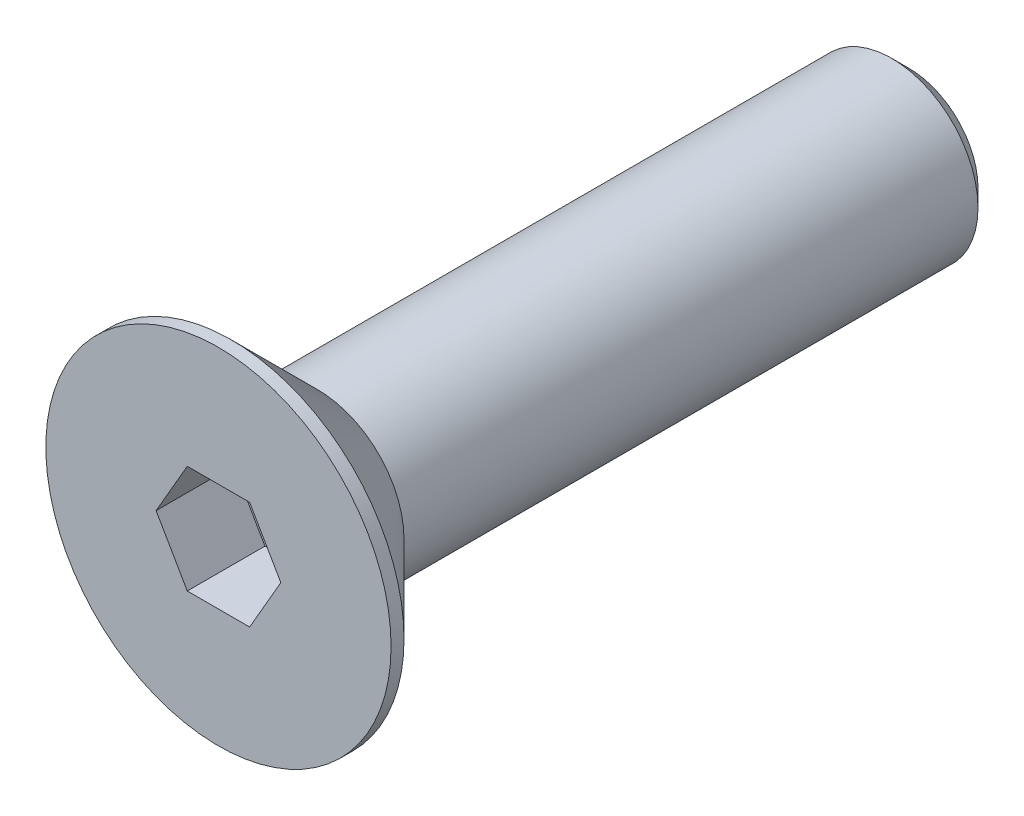
ISO-10303-21;
HEADER;
FILE_DESCRIPTION(('STEP AP214'),'2;1');
FILE_NAME('part.step','',(''),(''),'','','');
FILE_SCHEMA(('AUTOMOTIVE_DESIGN { 1 0 10303 214 1 1 1 1 }'));
ENDSEC;
DATA;
#1=APPLICATION_CONTEXT('core data for automotive mechanical design processes');
#2=APPLICATION_PROTOCOL_DEFINITION('international standard','automotive_design',2000,#1);
#3=PRODUCT_CONTEXT('',#1,'mechanical');
#4=PRODUCT('Part','Part','',(#3));
#5=PRODUCT_RELATED_PRODUCT_CATEGORY('part','',(#4));
#6=PRODUCT_DEFINITION_FORMATION('','',#4);
#7=PRODUCT_DEFINITION_CONTEXT('part definition',#1,'design');
#8=PRODUCT_DEFINITION('design','',#6,#7);
#9=PRODUCT_DEFINITION_SHAPE('','',#8);
#10=(LENGTH_UNIT() NAMED_UNIT(*) SI_UNIT(.MILLI.,.METRE.));
#11=(NAMED_UNIT(*) PLANE_ANGLE_UNIT() SI_UNIT($,.RADIAN.));
#12=(NAMED_UNIT(*) SI_UNIT($,.STERADIAN.) SOLID_ANGLE_UNIT());
#13=UNCERTAINTY_MEASURE_WITH_UNIT(LENGTH_MEASURE(1.E-05),#10,'distance_accuracy_value','');
#14=(GEOMETRIC_REPRESENTATION_CONTEXT(3) GLOBAL_UNCERTAINTY_ASSIGNED_CONTEXT((#13)) GLOBAL_UNIT_ASSIGNED_CONTEXT((#10,
#11,#12)) REPRESENTATION_CONTEXT('',''));
#15=CARTESIAN_POINT('',(0.,0.,0.));
#16=DIRECTION('',(0.,0.,1.));
#17=DIRECTION('',(1.,0.,0.));
#18=AXIS2_PLACEMENT_3D('',#15,#16,#17);
#19=CARTESIAN_POINT('',(0.,0.,-13.7));
#20=DIRECTION('',(0.,0.,1.));
#21=DIRECTION('',(1.,0.,0.));
#22=AXIS2_PLACEMENT_3D('',#19,#20,#21);
#23=PLANE('',#22);
#24=CARTESIAN_POINT('',(0.,0.,-13.7));
#25=DIRECTION('',(0.,0.,1.));
#26=DIRECTION('',(1.,0.,0.));
#27=AXIS2_PLACEMENT_3D('',#24,#25,#26);
#28=CIRCLE('',#27,1.6);
#29=CARTESIAN_POINT('',(1.6,0.,-13.7));
#30=VERTEX_POINT('',#29);
#31=EDGE_CURVE('E28',#30,#30,#28,.T.);
#32=ORIENTED_EDGE('',*,*,#31,.F.);
#33=EDGE_LOOP('',(#32));
#34=FACE_BOUND('',#33,.T.);
#35=ADVANCED_FACE('F17',(#34),#23,.F.);
#36=CARTESIAN_POINT('',(0.,0.,-13.7));
#37=DIRECTION('',(0.,0.,1.));
#38=DIRECTION('',(1.,0.,0.));
#39=AXIS2_PLACEMENT_3D('',#36,#37,#38);
#40=CONICAL_SURFACE('',#39,1.6,0.785398163397);
#41=ORIENTED_EDGE('',*,*,#31,.T.);
#42=DIRECTION('',(0.707106781186548,0.,0.707106781186548));
#43=VECTOR('',#42,1.);
#44=CARTESIAN_POINT('',(1.6,0.,-13.7));
#45=LINE('',#44,#43);
#46=CARTESIAN_POINT('',(2.,0.,-13.3));
#47=VERTEX_POINT('',#46);
#48=EDGE_CURVE('E11',#30,#47,#45,.T.);
#49=ORIENTED_EDGE('',*,*,#48,.T.);
#50=CARTESIAN_POINT('',(0.,0.,-13.3));
#51=DIRECTION('',(0.,0.,1.));
#52=DIRECTION('',(1.,0.,0.));
#53=AXIS2_PLACEMENT_3D('',#50,#51,#52);
#54=CIRCLE('',#53,2.);
#55=EDGE_CURVE('E161',#47,#47,#54,.T.);
#56=ORIENTED_EDGE('',*,*,#55,.F.);
#57=ORIENTED_EDGE('',*,*,#48,.F.);
#58=EDGE_LOOP('',(#41,#49,#56,#57));
#59=FACE_BOUND('',#58,.T.);
#60=ADVANCED_FACE('F217',(#59),#40,.T.);
#61=CARTESIAN_POINT('',(0.,0.,-13.3));
#62=DIRECTION('',(0.,0.,1.));
#63=DIRECTION('',(1.,0.,0.));
#64=AXIS2_PLACEMENT_3D('',#61,#62,#63);
#65=CYLINDRICAL_SURFACE('',#64,2.);
#66=ORIENTED_EDGE('',*,*,#55,.T.);
#67=DIRECTION('',(0.,0.,1.));
#68=VECTOR('',#67,1.);
#69=CARTESIAN_POINT('',(2.,0.,-13.3));
#70=LINE('',#69,#68);
#71=CARTESIAN_POINT('',(2.,0.,0.));
#72=VERTEX_POINT('',#71);
#73=EDGE_CURVE('E164',#47,#72,#70,.T.);
#74=ORIENTED_EDGE('',*,*,#73,.T.);
#75=CARTESIAN_POINT('',(0.,0.,0.));
#76=DIRECTION('',(0.,0.,1.));
#77=DIRECTION('',(1.,0.,0.));
#78=AXIS2_PLACEMENT_3D('',#75,#76,#77);
#79=CIRCLE('',#78,2.);
#80=EDGE_CURVE('E165',#72,#72,#79,.T.);
#81=ORIENTED_EDGE('',*,*,#80,.F.);
#82=ORIENTED_EDGE('',*,*,#73,.F.);
#83=EDGE_LOOP('',(#66,#74,#81,#82));
#84=FACE_BOUND('',#83,.T.);
#85=ADVANCED_FACE('F226',(#84),#65,.T.);
#86=CARTESIAN_POINT('',(0.,0.,0.5));
#87=DIRECTION('',(0.,0.,1.));
#88=DIRECTION('',(1.,0.,0.));
#89=AXIS2_PLACEMENT_3D('',#86,#87,#88);
#90=PLANE('',#89);
#91=DIRECTION('',(-0.50000000000019,0.866025403784329,0.));
#92=VECTOR('',#91,1.);
#93=CARTESIAN_POINT('',(1.445,0.,0.5));
#94=LINE('',#93,#92);
#95=CARTESIAN_POINT('',(1.445,0.,0.5));
#96=VERTEX_POINT('',#95);
#97=CARTESIAN_POINT('',(0.7225,1.251406708469,0.5));
#98=VERTEX_POINT('',#97);
#99=EDGE_CURVE('E101',#96,#98,#94,.T.);
#100=ORIENTED_EDGE('',*,*,#99,.T.);
#101=DIRECTION('',(-1.,0.,0.));
#102=VECTOR('',#101,1.);
#103=CARTESIAN_POINT('',(0.7225,1.251406708469,0.5));
#104=LINE('',#103,#102);
#105=CARTESIAN_POINT('',(-0.7225,1.251406708469,0.5));
#106=VERTEX_POINT('',#105);
#107=EDGE_CURVE('E94',#98,#106,#104,.T.);
#108=ORIENTED_EDGE('',*,*,#107,.T.);
#109=DIRECTION('',(-0.50000000000019,-0.866025403784329,0.));
#110=VECTOR('',#109,1.);
#111=CARTESIAN_POINT('',(-0.7225,1.251406708469,0.5));
#112=LINE('',#111,#110);
#113=CARTESIAN_POINT('',(-1.445,0.,0.5));
#114=VERTEX_POINT('',#113);
#115=EDGE_CURVE('E168',#106,#114,#112,.T.);
#116=ORIENTED_EDGE('',*,*,#115,.T.);
#117=DIRECTION('',(0.50000000000019,-0.866025403784329,0.));
#118=VECTOR('',#117,1.);
#119=CARTESIAN_POINT('',(-1.445,0.,0.5));
#120=LINE('',#119,#118);
#121=CARTESIAN_POINT('',(-0.7225,-1.251406708469,0.5));
#122=VERTEX_POINT('',#121);
#123=EDGE_CURVE('E169',#114,#122,#120,.T.);
#124=ORIENTED_EDGE('',*,*,#123,.T.);
#125=DIRECTION('',(1.,0.,0.));
#126=VECTOR('',#125,1.);
#127=CARTESIAN_POINT('',(-0.7225,-1.251406708469,0.5));
#128=LINE('',#127,#126);
#129=CARTESIAN_POINT('',(0.7225,-1.251406708469,0.5));
#130=VERTEX_POINT('',#129);
#131=EDGE_CURVE('E111',#122,#130,#128,.T.);
#132=ORIENTED_EDGE('',*,*,#131,.T.);
#133=DIRECTION('',(0.50000000000019,0.866025403784329,0.));
#134=VECTOR('',#133,1.);
#135=CARTESIAN_POINT('',(0.7225,-1.251406708469,0.5));
#136=LINE('',#135,#134);
#137=EDGE_CURVE('E136',#130,#96,#136,.T.);
#138=ORIENTED_EDGE('',*,*,#137,.T.);
#139=EDGE_LOOP('',(#100,#108,#116,#124,#132,#138));
#140=FACE_BOUND('',#139,.T.);
#141=ADVANCED_FACE('F247',(#140),#90,.T.);
#142=CARTESIAN_POINT('',(0.,0.,2.));
#143=DIRECTION('',(0.,0.,1.));
#144=DIRECTION('',(1.,0.,0.));
#145=AXIS2_PLACEMENT_3D('',#142,#143,#144);
#146=CONICAL_SURFACE('',#145,4.,0.785398163397);
#147=DIRECTION('',(-0.707106781186548,0.,-0.707106781186548));
#148=VECTOR('',#147,1.);
#149=CARTESIAN_POINT('',(4.,0.,2.));
#150=LINE('',#149,#148);
#151=CARTESIAN_POINT('',(4.,0.,2.));
#152=VERTEX_POINT('',#151);
#153=EDGE_CURVE('E21',#152,#72,#150,.T.);
#154=ORIENTED_EDGE('',*,*,#153,.T.);
#155=ORIENTED_EDGE('',*,*,#80,.T.);
#156=ORIENTED_EDGE('',*,*,#153,.F.);
#157=CARTESIAN_POINT('',(0.,0.,2.));
#158=DIRECTION('',(0.,0.,1.));
#159=DIRECTION('',(1.,0.,0.));
#160=AXIS2_PLACEMENT_3D('',#157,#158,#159);
#161=CIRCLE('',#160,4.);
#162=EDGE_CURVE('E173',#152,#152,#161,.T.);
#163=ORIENTED_EDGE('',*,*,#162,.F.);
#164=EDGE_LOOP('',(#154,#155,#156,#163));
#165=FACE_BOUND('',#164,.T.);
#166=ADVANCED_FACE('F232',(#165),#146,.T.);
#167=CARTESIAN_POINT('',(1.445,0.,0.5));
#168=DIRECTION('',(-0.866025403784329,-0.50000000000019,0.));
#169=DIRECTION('',(-0.50000000000019,0.866025403784329,0.));
#170=AXIS2_PLACEMENT_3D('',#167,#168,#169);
#171=PLANE('',#170);
#172=DIRECTION('',(0.,0.,1.));
#173=VECTOR('',#172,1.);
#174=CARTESIAN_POINT('',(1.445,0.,0.5));
#175=LINE('',#174,#173);
#176=CARTESIAN_POINT('',(1.445,0.,2.3));
#177=VERTEX_POINT('',#176);
#178=EDGE_CURVE('E127',#96,#177,#175,.T.);
#179=ORIENTED_EDGE('',*,*,#178,.T.);
#180=DIRECTION('',(-0.50000000000019,0.866025403784329,0.));
#181=VECTOR('',#180,1.);
#182=CARTESIAN_POINT('',(1.445,0.,2.3));
#183=LINE('',#182,#181);
#184=CARTESIAN_POINT('',(0.7225,1.251406708469,2.3));
#185=VERTEX_POINT('',#184);
#186=EDGE_CURVE('E132',#177,#185,#183,.T.);
#187=ORIENTED_EDGE('',*,*,#186,.T.);
#188=DIRECTION('',(0.,0.,1.));
#189=VECTOR('',#188,1.);
#190=CARTESIAN_POINT('',(0.7225,1.251406708469,0.5));
#191=LINE('',#190,#189);
#192=EDGE_CURVE('E178',#98,#185,#191,.T.);
#193=ORIENTED_EDGE('',*,*,#192,.F.);
#194=ORIENTED_EDGE('',*,*,#99,.F.);
#195=EDGE_LOOP('',(#179,#187,#193,#194));
#196=FACE_BOUND('',#195,.T.);
#197=ADVANCED_FACE('F129',(#196),#171,.T.);
#198=CARTESIAN_POINT('',(0.7225,1.251406708469,0.5));
#199=DIRECTION('',(0.,-1.,0.));
#200=DIRECTION('',(-1.,0.,0.));
#201=AXIS2_PLACEMENT_3D('',#198,#199,#200);
#202=PLANE('',#201);
#203=ORIENTED_EDGE('',*,*,#192,.T.);
#204=DIRECTION('',(-1.,0.,0.));
#205=VECTOR('',#204,1.);
#206=CARTESIAN_POINT('',(0.7225,1.251406708469,2.3));
#207=LINE('',#206,#205);
#208=CARTESIAN_POINT('',(-0.7225,1.251406708469,2.3));
#209=VERTEX_POINT('',#208);
#210=EDGE_CURVE('E152',#185,#209,#207,.T.);
#211=ORIENTED_EDGE('',*,*,#210,.T.);
#212=DIRECTION('',(0.,0.,1.));
#213=VECTOR('',#212,1.);
#214=CARTESIAN_POINT('',(-0.7225,1.251406708469,0.5));
#215=LINE('',#214,#213);
#216=EDGE_CURVE('E62',#106,#209,#215,.T.);
#217=ORIENTED_EDGE('',*,*,#216,.F.);
#218=ORIENTED_EDGE('',*,*,#107,.F.);
#219=EDGE_LOOP('',(#203,#211,#217,#218));
#220=FACE_BOUND('',#219,.T.);
#221=ADVANCED_FACE('F231',(#220),#202,.T.);
#222=CARTESIAN_POINT('',(-0.7225,1.251406708469,0.5));
#223=DIRECTION('',(0.866025403784329,-0.50000000000019,0.));
#224=DIRECTION('',(0.,0.,-1.));
#225=AXIS2_PLACEMENT_3D('',#222,#223,#224);
#226=PLANE('',#225);
#227=ORIENTED_EDGE('',*,*,#216,.T.);
#228=DIRECTION('',(-0.50000000000019,-0.866025403784329,0.));
#229=VECTOR('',#228,1.);
#230=CARTESIAN_POINT('',(-0.7225,1.251406708469,2.3));
#231=LINE('',#230,#229);
#232=CARTESIAN_POINT('',(-1.445,0.,2.3));
#233=VERTEX_POINT('',#232);
#234=EDGE_CURVE('E158',#209,#233,#231,.T.);
#235=ORIENTED_EDGE('',*,*,#234,.T.);
#236=DIRECTION('',(0.,0.,1.));
#237=VECTOR('',#236,1.);
#238=CARTESIAN_POINT('',(-1.445,0.,0.5));
#239=LINE('',#238,#237);
#240=EDGE_CURVE('E77',#114,#233,#239,.T.);
#241=ORIENTED_EDGE('',*,*,#240,.F.);
#242=ORIENTED_EDGE('',*,*,#115,.F.);
#243=EDGE_LOOP('',(#227,#235,#241,#242));
#244=FACE_BOUND('',#243,.T.);
#245=ADVANCED_FACE('F236',(#244),#226,.T.);
#246=CARTESIAN_POINT('',(-1.445,0.,0.5));
#247=DIRECTION('',(0.866025403784329,0.50000000000019,0.));
#248=DIRECTION('',(0.,0.,-1.));
#249=AXIS2_PLACEMENT_3D('',#246,#247,#248);
#250=PLANE('',#249);
#251=ORIENTED_EDGE('',*,*,#240,.T.);
#252=DIRECTION('',(0.50000000000019,-0.866025403784329,0.));
#253=VECTOR('',#252,1.);
#254=CARTESIAN_POINT('',(-1.445,0.,2.3));
#255=LINE('',#254,#253);
#256=CARTESIAN_POINT('',(-0.7225,-1.251406708469,2.3));
#257=VERTEX_POINT('',#256);
#258=EDGE_CURVE('E194',#233,#257,#255,.T.);
#259=ORIENTED_EDGE('',*,*,#258,.T.);
#260=DIRECTION('',(0.,0.,1.));
#261=VECTOR('',#260,1.);
#262=CARTESIAN_POINT('',(-0.7225,-1.251406708469,0.5));
#263=LINE('',#262,#261);
#264=EDGE_CURVE('E171',#122,#257,#263,.T.);
#265=ORIENTED_EDGE('',*,*,#264,.F.);
#266=ORIENTED_EDGE('',*,*,#123,.F.);
#267=EDGE_LOOP('',(#251,#259,#265,#266));
#268=FACE_BOUND('',#267,.T.);
#269=ADVANCED_FACE('F239',(#268),#250,.T.);
#270=CARTESIAN_POINT('',(-0.7225,-1.251406708469,0.5));
#271=DIRECTION('',(0.,1.,0.));
#272=DIRECTION('',(1.,0.,0.));
#273=AXIS2_PLACEMENT_3D('',#270,#271,#272);
#274=PLANE('',#273);
#275=ORIENTED_EDGE('',*,*,#264,.T.);
#276=DIRECTION('',(1.,0.,0.));
#277=VECTOR('',#276,1.);
#278=CARTESIAN_POINT('',(-0.7225,-1.251406708469,2.3));
#279=LINE('',#278,#277);
#280=CARTESIAN_POINT('',(0.7225,-1.251406708469,2.3));
#281=VERTEX_POINT('',#280);
#282=EDGE_CURVE('E185',#257,#281,#279,.T.);
#283=ORIENTED_EDGE('',*,*,#282,.T.);
#284=DIRECTION('',(0.,0.,1.));
#285=VECTOR('',#284,1.);
#286=CARTESIAN_POINT('',(0.7225,-1.251406708469,0.5));
#287=LINE('',#286,#285);
#288=EDGE_CURVE('E137',#130,#281,#287,.T.);
#289=ORIENTED_EDGE('',*,*,#288,.F.);
#290=ORIENTED_EDGE('',*,*,#131,.F.);
#291=EDGE_LOOP('',(#275,#283,#289,#290));
#292=FACE_BOUND('',#291,.T.);
#293=ADVANCED_FACE('F235',(#292),#274,.T.);
#294=CARTESIAN_POINT('',(0.7225,-1.251406708469,0.5));
#295=DIRECTION('',(-0.866025403784329,0.50000000000019,0.));
#296=DIRECTION('',(0.,0.,1.));
#297=AXIS2_PLACEMENT_3D('',#294,#295,#296);
#298=PLANE('',#297);
#299=ORIENTED_EDGE('',*,*,#288,.T.);
#300=DIRECTION('',(0.50000000000019,0.866025403784329,0.));
#301=VECTOR('',#300,1.);
#302=CARTESIAN_POINT('',(0.7225,-1.251406708469,2.3));
#303=LINE('',#302,#301);
#304=EDGE_CURVE('E140',#281,#177,#303,.T.);
#305=ORIENTED_EDGE('',*,*,#304,.T.);
#306=ORIENTED_EDGE('',*,*,#178,.F.);
#307=ORIENTED_EDGE('',*,*,#137,.F.);
#308=EDGE_LOOP('',(#299,#305,#306,#307));
#309=FACE_BOUND('',#308,.T.);
#310=ADVANCED_FACE('F141',(#309),#298,.T.);
#311=CARTESIAN_POINT('',(0.,0.,2.3));
#312=DIRECTION('',(0.,0.,-1.));
#313=DIRECTION('',(1.,0.,0.));
#314=AXIS2_PLACEMENT_3D('',#311,#312,#313);
#315=CYLINDRICAL_SURFACE('',#314,4.);
#316=DIRECTION('',(0.,0.,-1.));
#317=VECTOR('',#316,1.);
#318=CARTESIAN_POINT('',(4.,0.,2.3));
#319=LINE('',#318,#317);
#320=CARTESIAN_POINT('',(4.,0.,2.3));
#321=VERTEX_POINT('',#320);
#322=EDGE_CURVE('E147',#321,#152,#319,.T.);
#323=ORIENTED_EDGE('',*,*,#322,.T.);
#324=ORIENTED_EDGE('',*,*,#162,.T.);
#325=ORIENTED_EDGE('',*,*,#322,.F.);
#326=CARTESIAN_POINT('',(0.,0.,2.3));
#327=DIRECTION('',(0.,0.,1.));
#328=DIRECTION('',(1.,0.,0.));
#329=AXIS2_PLACEMENT_3D('',#326,#327,#328);
#330=CIRCLE('',#329,4.);
#331=EDGE_CURVE('E181',#321,#321,#330,.T.);
#332=ORIENTED_EDGE('',*,*,#331,.F.);
#333=EDGE_LOOP('',(#323,#324,#325,#332));
#334=FACE_BOUND('',#333,.T.);
#335=ADVANCED_FACE('F19',(#334),#315,.T.);
#336=CARTESIAN_POINT('',(0.,0.,2.3));
#337=DIRECTION('',(0.,0.,1.));
#338=DIRECTION('',(1.,0.,0.));
#339=AXIS2_PLACEMENT_3D('',#336,#337,#338);
#340=PLANE('',#339);
#341=ORIENTED_EDGE('',*,*,#282,.F.);
#342=ORIENTED_EDGE('',*,*,#258,.F.);
#343=ORIENTED_EDGE('',*,*,#234,.F.);
#344=ORIENTED_EDGE('',*,*,#210,.F.);
#345=ORIENTED_EDGE('',*,*,#186,.F.);
#346=ORIENTED_EDGE('',*,*,#304,.F.);
#347=EDGE_LOOP('',(#341,#342,#343,#344,#345,#346));
#348=FACE_BOUND('',#347,.T.);
#349=ORIENTED_EDGE('',*,*,#331,.T.);
#350=EDGE_LOOP('',(#349));
#351=FACE_BOUND('',#350,.T.);
#352=ADVANCED_FACE('F149',(#348,#351),#340,.T.);
#353=CLOSED_SHELL('',(#35,#60,#85,#141,#166,#197,#221,#245,#269,#293,#310,#335,#352));
#354=MANIFOLD_SOLID_BREP('B1',#353);
#355=ADVANCED_BREP_SHAPE_REPRESENTATION('',(#18,#354),#14);
#356=SHAPE_DEFINITION_REPRESENTATION(#9,#355);
ENDSEC;
END-ISO-10303-21;
